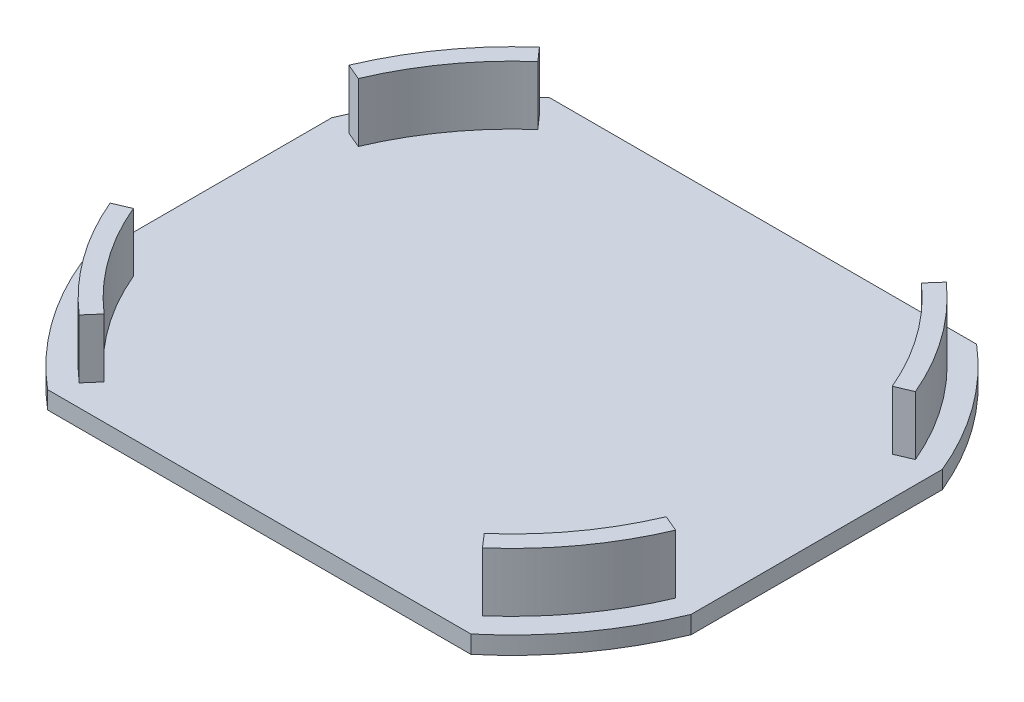
ISO-10303-21;
HEADER;
FILE_DESCRIPTION(('STEP AP214'),'2;1');
FILE_NAME('part.step','',(''),(''),'','','');
FILE_SCHEMA(('AUTOMOTIVE_DESIGN { 1 0 10303 214 1 1 1 1 }'));
ENDSEC;
DATA;
#1=APPLICATION_CONTEXT('core data for automotive mechanical design processes');
#2=APPLICATION_PROTOCOL_DEFINITION('international standard','automotive_design',2000,#1);
#3=PRODUCT_CONTEXT('',#1,'mechanical');
#4=PRODUCT('Part','Part','',(#3));
#5=PRODUCT_RELATED_PRODUCT_CATEGORY('part','',(#4));
#6=PRODUCT_DEFINITION_FORMATION('','',#4);
#7=PRODUCT_DEFINITION_CONTEXT('part definition',#1,'design');
#8=PRODUCT_DEFINITION('design','',#6,#7);
#9=PRODUCT_DEFINITION_SHAPE('','',#8);
#10=(LENGTH_UNIT() NAMED_UNIT(*) SI_UNIT(.MILLI.,.METRE.));
#11=(NAMED_UNIT(*) PLANE_ANGLE_UNIT() SI_UNIT($,.RADIAN.));
#12=(NAMED_UNIT(*) SI_UNIT($,.STERADIAN.) SOLID_ANGLE_UNIT());
#13=UNCERTAINTY_MEASURE_WITH_UNIT(LENGTH_MEASURE(1.E-05),#10,'distance_accuracy_value','');
#14=(GEOMETRIC_REPRESENTATION_CONTEXT(3) GLOBAL_UNCERTAINTY_ASSIGNED_CONTEXT((#13)) GLOBAL_UNIT_ASSIGNED_CONTEXT((#10,
#11,#12)) REPRESENTATION_CONTEXT('',''));
#15=CARTESIAN_POINT('',(0.,0.,0.));
#16=DIRECTION('',(0.,0.,1.));
#17=DIRECTION('',(1.,0.,0.));
#18=AXIS2_PLACEMENT_3D('',#15,#16,#17);
#19=CARTESIAN_POINT('',(0.,1.5,0.));
#20=DIRECTION('',(0.,1.,0.));
#21=DIRECTION('',(0.,0.,1.));
#22=AXIS2_PLACEMENT_3D('',#19,#20,#21);
#23=PLANE('',#22);
#24=CARTESIAN_POINT('',(0.,1.5,0.));
#25=DIRECTION('',(0.,1.,0.));
#26=DIRECTION('',(0.,0.,1.));
#27=AXIS2_PLACEMENT_3D('',#24,#25,#26);
#28=CIRCLE('',#27,28.);
#29=CARTESIAN_POINT('',(-18.1370651125038,1.5,-21.3318276081727));
#30=VERTEX_POINT('',#29);
#31=CARTESIAN_POINT('',(-25.9101771725426,1.5,-10.6142695880336));
#32=VERTEX_POINT('',#31);
#33=EDGE_CURVE('E310',#30,#32,#28,.T.);
#34=ORIENTED_EDGE('',*,*,#33,.T.);
#35=DIRECTION('',(0.,0.,1.));
#36=VECTOR('',#35,1.);
#37=CARTESIAN_POINT('',(-25.9101771725426,1.5,-10.6142695880336));
#38=LINE('',#37,#36);
#39=CARTESIAN_POINT('',(-25.9101771725426,1.5,10.6142695880336));
#40=VERTEX_POINT('',#39);
#41=EDGE_CURVE('E313',#32,#40,#38,.T.);
#42=ORIENTED_EDGE('',*,*,#41,.T.);
#43=CARTESIAN_POINT('',(0.,1.5,0.));
#44=DIRECTION('',(0.,1.,0.));
#45=DIRECTION('',(0.,0.,1.));
#46=AXIS2_PLACEMENT_3D('',#43,#44,#45);
#47=CIRCLE('',#46,28.);
#48=CARTESIAN_POINT('',(-17.9754714584844,1.5,21.4681723918273));
#49=VERTEX_POINT('',#48);
#50=EDGE_CURVE('E316',#40,#49,#47,.T.);
#51=ORIENTED_EDGE('',*,*,#50,.T.);
#52=DIRECTION('',(-1.,0.,0.));
#53=VECTOR('',#52,1.);
#54=CARTESIAN_POINT('',(17.9754714584844,1.5,21.4681723918273));
#55=LINE('',#54,#53);
#56=CARTESIAN_POINT('',(17.9754714584844,1.5,21.4681723918273));
#57=VERTEX_POINT('',#56);
#58=EDGE_CURVE('E318',#57,#49,#55,.T.);
#59=ORIENTED_EDGE('',*,*,#58,.F.);
#60=CARTESIAN_POINT('',(0.,1.5,0.));
#61=DIRECTION('',(0.,1.,0.));
#62=DIRECTION('',(0.,0.,1.));
#63=AXIS2_PLACEMENT_3D('',#60,#61,#62);
#64=CIRCLE('',#63,28.);
#65=CARTESIAN_POINT('',(25.8898228274574,1.5,10.6638207957029));
#66=VERTEX_POINT('',#65);
#67=EDGE_CURVE('E321',#57,#66,#64,.T.);
#68=ORIENTED_EDGE('',*,*,#67,.T.);
#69=DIRECTION('',(0.,0.,1.));
#70=VECTOR('',#69,1.);
#71=CARTESIAN_POINT('',(25.8898228274574,1.5,-10.6638207957029));
#72=LINE('',#71,#70);
#73=CARTESIAN_POINT('',(25.8898228274574,1.5,-10.6638207957029));
#74=VERTEX_POINT('',#73);
#75=EDGE_CURVE('E323',#74,#66,#72,.T.);
#76=ORIENTED_EDGE('',*,*,#75,.F.);
#77=CARTESIAN_POINT('',(0.,1.5,0.));
#78=DIRECTION('',(0.,1.,0.));
#79=DIRECTION('',(0.,0.,1.));
#80=AXIS2_PLACEMENT_3D('',#77,#78,#79);
#81=CIRCLE('',#80,28.);
#82=CARTESIAN_POINT('',(18.1370651125038,1.5,-21.3318276081727));
#83=VERTEX_POINT('',#82);
#84=EDGE_CURVE('E326',#74,#83,#81,.T.);
#85=ORIENTED_EDGE('',*,*,#84,.T.);
#86=DIRECTION('',(1.,0.,0.));
#87=VECTOR('',#86,1.);
#88=CARTESIAN_POINT('',(-18.1370651125038,1.5,-21.3318276081727));
#89=LINE('',#88,#87);
#90=EDGE_CURVE('E328',#30,#83,#89,.T.);
#91=ORIENTED_EDGE('',*,*,#90,.F.);
#92=EDGE_LOOP('',(#34,#42,#51,#59,#68,#76,#85,#91));
#93=FACE_BOUND('',#92,.T.);
#94=DIRECTION('',(0.921435232050472,0.,0.388531997570462));
#95=VECTOR('',#94,1.);
#96=CARTESIAN_POINT('',(-24.0494595565173,1.5,-10.1965281433696));
#97=LINE('',#96,#95);
#98=CARTESIAN_POINT('',(-24.0494595565173,1.5,-10.1965281433696));
#99=VERTEX_POINT('',#98);
#100=CARTESIAN_POINT('',(-22.6673067084416,1.5,-9.61373014701392));
#101=VERTEX_POINT('',#100);
#102=EDGE_CURVE('E294',#99,#101,#97,.T.);
#103=ORIENTED_EDGE('',*,*,#102,.F.);
#104=CARTESIAN_POINT('',(0.,1.5,-0.0558430067805846));
#105=DIRECTION('',(0.,1.,0.));
#106=DIRECTION('',(0.,0.,1.));
#107=AXIS2_PLACEMENT_3D('',#104,#105,#106);
#108=CIRCLE('',#107,26.1);
#109=CARTESIAN_POINT('',(-17.283724514649,1.5,-19.6130122012658));
#110=VERTEX_POINT('',#109);
#111=EDGE_CURVE('E280',#110,#99,#108,.T.);
#112=ORIENTED_EDGE('',*,*,#111,.F.);
#113=DIRECTION('',(-0.662211667227935,0.,-0.749316827374909));
#114=VECTOR('',#113,1.);
#115=CARTESIAN_POINT('',(-17.283724514649,1.5,-19.6130122012658));
#116=LINE('',#115,#114);
#117=CARTESIAN_POINT('',(-16.2904070138071,1.5,-18.4890369602034));
#118=VERTEX_POINT('',#117);
#119=EDGE_CURVE('E285',#118,#110,#116,.T.);
#120=ORIENTED_EDGE('',*,*,#119,.F.);
#121=CARTESIAN_POINT('',(0.,1.5,-0.0558430067805833));
#122=DIRECTION('',(0.,-1.,0.));
#123=DIRECTION('',(0.,0.,1.));
#124=AXIS2_PLACEMENT_3D('',#121,#122,#123);
#125=CIRCLE('',#124,24.6);
#126=EDGE_CURVE('E296',#101,#118,#125,.T.);
#127=ORIENTED_EDGE('',*,*,#126,.F.);
#128=EDGE_LOOP('',(#103,#112,#120,#127));
#129=FACE_BOUND('',#128,.T.);
#130=DIRECTION('',(-0.662211667227933,0.,0.749316827374911));
#131=VECTOR('',#130,1.);
#132=CARTESIAN_POINT('',(17.283724514649,1.5,-19.6130122012658));
#133=LINE('',#132,#131);
#134=CARTESIAN_POINT('',(17.283724514649,1.5,-19.6130122012658));
#135=VERTEX_POINT('',#134);
#136=CARTESIAN_POINT('',(16.2904070138071,1.5,-18.4890369602034));
#137=VERTEX_POINT('',#136);
#138=EDGE_CURVE('E265',#135,#137,#133,.T.);
#139=ORIENTED_EDGE('',*,*,#138,.F.);
#140=CARTESIAN_POINT('',(0.,1.5,-0.0558430067805846));
#141=DIRECTION('',(0.,1.,0.));
#142=DIRECTION('',(0.,0.,1.));
#143=AXIS2_PLACEMENT_3D('',#140,#141,#142);
#144=CIRCLE('',#143,26.1);
#145=CARTESIAN_POINT('',(24.0294878119037,1.5,-10.2437630838901));
#146=VERTEX_POINT('',#145);
#147=EDGE_CURVE('E251',#146,#135,#144,.T.);
#148=ORIENTED_EDGE('',*,*,#147,.F.);
#149=DIRECTION('',(0.920670031107421,0.,-0.390341765406496));
#150=VECTOR('',#149,1.);
#151=CARTESIAN_POINT('',(22.6484827652426,1.5,-9.65825043578035));
#152=LINE('',#151,#150);
#153=CARTESIAN_POINT('',(22.6484827652426,1.5,-9.65825043578035));
#154=VERTEX_POINT('',#153);
#155=EDGE_CURVE('E256',#154,#146,#152,.T.);
#156=ORIENTED_EDGE('',*,*,#155,.F.);
#157=CARTESIAN_POINT('',(0.,1.5,-0.0558430067805833));
#158=DIRECTION('',(0.,-1.,0.));
#159=DIRECTION('',(0.,0.,1.));
#160=AXIS2_PLACEMENT_3D('',#157,#158,#159);
#161=CIRCLE('',#160,24.6);
#162=EDGE_CURVE('E267',#137,#154,#161,.T.);
#163=ORIENTED_EDGE('',*,*,#162,.F.);
#164=EDGE_LOOP('',(#139,#148,#156,#163));
#165=FACE_BOUND('',#164,.T.);
#166=DIRECTION('',(0.656366061645361,0.,-0.754442571121327));
#167=VECTOR('',#166,1.);
#168=CARTESIAN_POINT('',(-16.1466051164759,1.5,18.503444242804));
#169=LINE('',#168,#167);
#170=CARTESIAN_POINT('',(-17.131154208944,1.5,19.635108099486));
#171=VERTEX_POINT('',#170);
#172=CARTESIAN_POINT('',(-16.1466051164759,1.5,18.503444242804));
#173=VERTEX_POINT('',#172);
#174=EDGE_CURVE('E223',#171,#173,#169,.T.);
#175=ORIENTED_EDGE('',*,*,#174,.F.);
#176=CARTESIAN_POINT('',(0.,1.5,-0.0558430067805846));
#177=DIRECTION('',(0.,1.,0.));
#178=DIRECTION('',(0.,0.,1.));
#179=AXIS2_PLACEMENT_3D('',#176,#177,#178);
#180=CIRCLE('',#179,26.1);
#181=CARTESIAN_POINT('',(-24.0494595565174,1.5,10.0848421298084));
#182=VERTEX_POINT('',#181);
#183=EDGE_CURVE('E220',#182,#171,#180,.T.);
#184=ORIENTED_EDGE('',*,*,#183,.F.);
#185=DIRECTION('',(-0.92143523205047,0.,0.388531997570465));
#186=VECTOR('',#185,1.);
#187=CARTESIAN_POINT('',(-24.0494595565174,1.5,10.0848421298084));
#188=LINE('',#187,#186);
#189=CARTESIAN_POINT('',(-22.6673067084416,1.5,9.50204413345273));
#190=VERTEX_POINT('',#189);
#191=EDGE_CURVE('E232',#190,#182,#188,.T.);
#192=ORIENTED_EDGE('',*,*,#191,.F.);
#193=CARTESIAN_POINT('',(0.,1.5,-0.0558430067805833));
#194=DIRECTION('',(0.,-1.,0.));
#195=DIRECTION('',(0.,0.,1.));
#196=AXIS2_PLACEMENT_3D('',#193,#194,#195);
#197=CIRCLE('',#196,24.6);
#198=EDGE_CURVE('E240',#173,#190,#197,.T.);
#199=ORIENTED_EDGE('',*,*,#198,.F.);
#200=EDGE_LOOP('',(#175,#184,#192,#199));
#201=FACE_BOUND('',#200,.T.);
#202=DIRECTION('',(-0.920670031107423,0.,-0.390341765406493));
#203=VECTOR('',#202,1.);
#204=CARTESIAN_POINT('',(22.6484827652426,1.5,9.54656442221918));
#205=LINE('',#204,#203);
#206=CARTESIAN_POINT('',(24.0294878119037,1.5,10.1320770703289));
#207=VERTEX_POINT('',#206);
#208=CARTESIAN_POINT('',(22.6484827652426,1.5,9.54656442221918));
#209=VERTEX_POINT('',#208);
#210=EDGE_CURVE('E679',#207,#209,#205,.T.);
#211=ORIENTED_EDGE('',*,*,#210,.F.);
#212=CARTESIAN_POINT('',(0.,1.5,-0.0558430067805846));
#213=DIRECTION('',(0.,1.,0.));
#214=DIRECTION('',(0.,0.,1.));
#215=AXIS2_PLACEMENT_3D('',#212,#213,#214);
#216=CIRCLE('',#215,26.1);
#217=CARTESIAN_POINT('',(17.131154208944,1.5,19.635108099486));
#218=VERTEX_POINT('',#217);
#219=EDGE_CURVE('E218',#218,#207,#216,.T.);
#220=ORIENTED_EDGE('',*,*,#219,.F.);
#221=DIRECTION('',(0.656366061645363,0.,0.754442571121325));
#222=VECTOR('',#221,1.);
#223=CARTESIAN_POINT('',(16.1466051164759,1.5,18.503444242804));
#224=LINE('',#223,#222);
#225=CARTESIAN_POINT('',(16.1466051164759,1.5,18.503444242804));
#226=VERTEX_POINT('',#225);
#227=EDGE_CURVE('E214',#226,#218,#224,.T.);
#228=ORIENTED_EDGE('',*,*,#227,.F.);
#229=CARTESIAN_POINT('',(0.,1.5,-0.0558430067805833));
#230=DIRECTION('',(0.,-1.,0.));
#231=DIRECTION('',(0.,0.,1.));
#232=AXIS2_PLACEMENT_3D('',#229,#230,#231);
#233=CIRCLE('',#232,24.6);
#234=EDGE_CURVE('E676',#209,#226,#233,.T.);
#235=ORIENTED_EDGE('',*,*,#234,.F.);
#236=EDGE_LOOP('',(#211,#220,#228,#235));
#237=FACE_BOUND('',#236,.T.);
#238=ADVANCED_FACE('F33',(#93,#129,#165,#201,#237),#23,.T.);
#239=CARTESIAN_POINT('',(0.,1.5,0.));
#240=DIRECTION('',(0.,-1.,0.));
#241=DIRECTION('',(0.,0.,-1.));
#242=AXIS2_PLACEMENT_3D('',#239,#240,#241);
#243=CYLINDRICAL_SURFACE('',#242,28.);
#244=CARTESIAN_POINT('',(0.,0.,0.));
#245=DIRECTION('',(0.,1.,0.));
#246=DIRECTION('',(0.,0.,1.));
#247=AXIS2_PLACEMENT_3D('',#244,#245,#246);
#248=CIRCLE('',#247,28.);
#249=CARTESIAN_POINT('',(-18.1370651125038,0.,-21.3318276081727));
#250=VERTEX_POINT('',#249);
#251=CARTESIAN_POINT('',(-25.9101771725426,0.,-10.6142695880336));
#252=VERTEX_POINT('',#251);
#253=EDGE_CURVE('E309',#250,#252,#248,.T.);
#254=ORIENTED_EDGE('',*,*,#253,.T.);
#255=DIRECTION('',(0.,-1.,0.));
#256=VECTOR('',#255,1.);
#257=CARTESIAN_POINT('',(-25.9101771725426,1.5,-10.6142695880336));
#258=LINE('',#257,#256);
#259=EDGE_CURVE('E11',#32,#252,#258,.T.);
#260=ORIENTED_EDGE('',*,*,#259,.F.);
#261=ORIENTED_EDGE('',*,*,#33,.F.);
#262=DIRECTION('',(0.,-1.,0.));
#263=VECTOR('',#262,1.);
#264=CARTESIAN_POINT('',(-18.1370651125038,1.5,-21.3318276081727));
#265=LINE('',#264,#263);
#266=EDGE_CURVE('E331',#30,#250,#265,.T.);
#267=ORIENTED_EDGE('',*,*,#266,.T.);
#268=EDGE_LOOP('',(#254,#260,#261,#267));
#269=FACE_BOUND('',#268,.T.);
#270=ADVANCED_FACE('F35',(#269),#243,.T.);
#271=CARTESIAN_POINT('',(-25.9101771725426,1.5,-10.6142695880336));
#272=DIRECTION('',(1.,0.,0.));
#273=DIRECTION('',(0.,0.,-1.));
#274=AXIS2_PLACEMENT_3D('',#271,#272,#273);
#275=PLANE('',#274);
#276=DIRECTION('',(0.,0.,1.));
#277=VECTOR('',#276,1.);
#278=CARTESIAN_POINT('',(-25.9101771725426,0.,-10.6142695880336));
#279=LINE('',#278,#277);
#280=CARTESIAN_POINT('',(-25.9101771725426,0.,10.6142695880336));
#281=VERTEX_POINT('',#280);
#282=EDGE_CURVE('E334',#252,#281,#279,.T.);
#283=ORIENTED_EDGE('',*,*,#282,.T.);
#284=DIRECTION('',(0.,-1.,0.));
#285=VECTOR('',#284,1.);
#286=CARTESIAN_POINT('',(-25.9101771725426,1.5,10.6142695880336));
#287=LINE('',#286,#285);
#288=EDGE_CURVE('E41',#40,#281,#287,.T.);
#289=ORIENTED_EDGE('',*,*,#288,.F.);
#290=ORIENTED_EDGE('',*,*,#41,.F.);
#291=ORIENTED_EDGE('',*,*,#259,.T.);
#292=EDGE_LOOP('',(#283,#289,#290,#291));
#293=FACE_BOUND('',#292,.T.);
#294=ADVANCED_FACE('F387',(#293),#275,.F.);
#295=CARTESIAN_POINT('',(0.,1.5,0.));
#296=DIRECTION('',(0.,-1.,0.));
#297=DIRECTION('',(0.,0.,-1.));
#298=AXIS2_PLACEMENT_3D('',#295,#296,#297);
#299=CYLINDRICAL_SURFACE('',#298,28.);
#300=CARTESIAN_POINT('',(0.,0.,0.));
#301=DIRECTION('',(0.,1.,0.));
#302=DIRECTION('',(0.,0.,1.));
#303=AXIS2_PLACEMENT_3D('',#300,#301,#302);
#304=CIRCLE('',#303,28.);
#305=CARTESIAN_POINT('',(-17.9754714584844,0.,21.4681723918273));
#306=VERTEX_POINT('',#305);
#307=EDGE_CURVE('E336',#281,#306,#304,.T.);
#308=ORIENTED_EDGE('',*,*,#307,.T.);
#309=DIRECTION('',(0.,-1.,0.));
#310=VECTOR('',#309,1.);
#311=CARTESIAN_POINT('',(-17.9754714584844,1.5,21.4681723918273));
#312=LINE('',#311,#310);
#313=EDGE_CURVE('E362',#49,#306,#312,.T.);
#314=ORIENTED_EDGE('',*,*,#313,.F.);
#315=ORIENTED_EDGE('',*,*,#50,.F.);
#316=ORIENTED_EDGE('',*,*,#288,.T.);
#317=EDGE_LOOP('',(#308,#314,#315,#316));
#318=FACE_BOUND('',#317,.T.);
#319=ADVANCED_FACE('F368',(#318),#299,.T.);
#320=CARTESIAN_POINT('',(17.9754714584844,1.5,21.4681723918273));
#321=DIRECTION('',(0.,0.,1.));
#322=DIRECTION('',(1.,0.,0.));
#323=AXIS2_PLACEMENT_3D('',#320,#321,#322);
#324=PLANE('',#323);
#325=DIRECTION('',(-1.,0.,0.));
#326=VECTOR('',#325,1.);
#327=CARTESIAN_POINT('',(17.9754714584844,0.,21.4681723918273));
#328=LINE('',#327,#326);
#329=CARTESIAN_POINT('',(17.9754714584844,0.,21.4681723918273));
#330=VERTEX_POINT('',#329);
#331=EDGE_CURVE('E339',#330,#306,#328,.T.);
#332=ORIENTED_EDGE('',*,*,#331,.F.);
#333=DIRECTION('',(0.,-1.,0.));
#334=VECTOR('',#333,1.);
#335=CARTESIAN_POINT('',(17.9754714584844,1.5,21.4681723918273));
#336=LINE('',#335,#334);
#337=EDGE_CURVE('E360',#57,#330,#336,.T.);
#338=ORIENTED_EDGE('',*,*,#337,.F.);
#339=ORIENTED_EDGE('',*,*,#58,.T.);
#340=ORIENTED_EDGE('',*,*,#313,.T.);
#341=EDGE_LOOP('',(#332,#338,#339,#340));
#342=FACE_BOUND('',#341,.T.);
#343=ADVANCED_FACE('F377',(#342),#324,.T.);
#344=CARTESIAN_POINT('',(0.,1.5,0.));
#345=DIRECTION('',(0.,-1.,0.));
#346=DIRECTION('',(0.,0.,-1.));
#347=AXIS2_PLACEMENT_3D('',#344,#345,#346);
#348=CYLINDRICAL_SURFACE('',#347,28.);
#349=CARTESIAN_POINT('',(0.,0.,0.));
#350=DIRECTION('',(0.,1.,0.));
#351=DIRECTION('',(0.,0.,1.));
#352=AXIS2_PLACEMENT_3D('',#349,#350,#351);
#353=CIRCLE('',#352,28.);
#354=CARTESIAN_POINT('',(25.8898228274574,0.,10.6638207957029));
#355=VERTEX_POINT('',#354);
#356=EDGE_CURVE('E342',#330,#355,#353,.T.);
#357=ORIENTED_EDGE('',*,*,#356,.T.);
#358=DIRECTION('',(0.,-1.,0.));
#359=VECTOR('',#358,1.);
#360=CARTESIAN_POINT('',(25.8898228274574,1.5,10.6638207957029));
#361=LINE('',#360,#359);
#362=EDGE_CURVE('E358',#66,#355,#361,.T.);
#363=ORIENTED_EDGE('',*,*,#362,.F.);
#364=ORIENTED_EDGE('',*,*,#67,.F.);
#365=ORIENTED_EDGE('',*,*,#337,.T.);
#366=EDGE_LOOP('',(#357,#363,#364,#365));
#367=FACE_BOUND('',#366,.T.);
#368=ADVANCED_FACE('F401',(#367),#348,.T.);
#369=CARTESIAN_POINT('',(25.8898228274574,1.5,-10.6638207957029));
#370=DIRECTION('',(1.,0.,0.));
#371=DIRECTION('',(0.,0.,-1.));
#372=AXIS2_PLACEMENT_3D('',#369,#370,#371);
#373=PLANE('',#372);
#374=DIRECTION('',(0.,0.,1.));
#375=VECTOR('',#374,1.);
#376=CARTESIAN_POINT('',(25.8898228274574,0.,-10.6638207957029));
#377=LINE('',#376,#375);
#378=CARTESIAN_POINT('',(25.8898228274574,0.,-10.6638207957029));
#379=VERTEX_POINT('',#378);
#380=EDGE_CURVE('E345',#379,#355,#377,.T.);
#381=ORIENTED_EDGE('',*,*,#380,.F.);
#382=DIRECTION('',(0.,-1.,0.));
#383=VECTOR('',#382,1.);
#384=CARTESIAN_POINT('',(25.8898228274574,1.5,-10.6638207957029));
#385=LINE('',#384,#383);
#386=EDGE_CURVE('E356',#74,#379,#385,.T.);
#387=ORIENTED_EDGE('',*,*,#386,.F.);
#388=ORIENTED_EDGE('',*,*,#75,.T.);
#389=ORIENTED_EDGE('',*,*,#362,.T.);
#390=EDGE_LOOP('',(#381,#387,#388,#389));
#391=FACE_BOUND('',#390,.T.);
#392=ADVANCED_FACE('F399',(#391),#373,.T.);
#393=CARTESIAN_POINT('',(0.,1.5,0.));
#394=DIRECTION('',(0.,-1.,0.));
#395=DIRECTION('',(0.,0.,-1.));
#396=AXIS2_PLACEMENT_3D('',#393,#394,#395);
#397=CYLINDRICAL_SURFACE('',#396,28.);
#398=CARTESIAN_POINT('',(0.,0.,0.));
#399=DIRECTION('',(0.,1.,0.));
#400=DIRECTION('',(0.,0.,1.));
#401=AXIS2_PLACEMENT_3D('',#398,#399,#400);
#402=CIRCLE('',#401,28.);
#403=CARTESIAN_POINT('',(18.1370651125038,0.,-21.3318276081727));
#404=VERTEX_POINT('',#403);
#405=EDGE_CURVE('E348',#379,#404,#402,.T.);
#406=ORIENTED_EDGE('',*,*,#405,.T.);
#407=DIRECTION('',(0.,-1.,0.));
#408=VECTOR('',#407,1.);
#409=CARTESIAN_POINT('',(18.1370651125038,1.5,-21.3318276081727));
#410=LINE('',#409,#408);
#411=EDGE_CURVE('E354',#83,#404,#410,.T.);
#412=ORIENTED_EDGE('',*,*,#411,.F.);
#413=ORIENTED_EDGE('',*,*,#84,.F.);
#414=ORIENTED_EDGE('',*,*,#386,.T.);
#415=EDGE_LOOP('',(#406,#412,#413,#414));
#416=FACE_BOUND('',#415,.T.);
#417=ADVANCED_FACE('F396',(#416),#397,.T.);
#418=CARTESIAN_POINT('',(-18.1370651125038,1.5,-21.3318276081727));
#419=DIRECTION('',(0.,0.,-1.));
#420=DIRECTION('',(-1.,0.,0.));
#421=AXIS2_PLACEMENT_3D('',#418,#419,#420);
#422=PLANE('',#421);
#423=DIRECTION('',(1.,0.,0.));
#424=VECTOR('',#423,1.);
#425=CARTESIAN_POINT('',(-18.1370651125038,0.,-21.3318276081727));
#426=LINE('',#425,#424);
#427=EDGE_CURVE('E314',#250,#404,#426,.T.);
#428=ORIENTED_EDGE('',*,*,#427,.F.);
#429=ORIENTED_EDGE('',*,*,#266,.F.);
#430=ORIENTED_EDGE('',*,*,#90,.T.);
#431=ORIENTED_EDGE('',*,*,#411,.T.);
#432=EDGE_LOOP('',(#428,#429,#430,#431));
#433=FACE_BOUND('',#432,.T.);
#434=ADVANCED_FACE('F392',(#433),#422,.T.);
#435=CARTESIAN_POINT('',(0.,0.,0.));
#436=DIRECTION('',(0.,1.,0.));
#437=DIRECTION('',(0.,0.,1.));
#438=AXIS2_PLACEMENT_3D('',#435,#436,#437);
#439=PLANE('',#438);
#440=ORIENTED_EDGE('',*,*,#253,.F.);
#441=ORIENTED_EDGE('',*,*,#427,.T.);
#442=ORIENTED_EDGE('',*,*,#405,.F.);
#443=ORIENTED_EDGE('',*,*,#380,.T.);
#444=ORIENTED_EDGE('',*,*,#356,.F.);
#445=ORIENTED_EDGE('',*,*,#331,.T.);
#446=ORIENTED_EDGE('',*,*,#307,.F.);
#447=ORIENTED_EDGE('',*,*,#282,.F.);
#448=EDGE_LOOP('',(#440,#441,#442,#443,#444,#445,#446,#447));
#449=FACE_BOUND('',#448,.T.);
#450=ADVANCED_FACE('F373',(#449),#439,.F.);
#451=CARTESIAN_POINT('',(0.,6.5,-0.0558430067805846));
#452=DIRECTION('',(0.,-1.,0.));
#453=DIRECTION('',(0.,0.,-1.));
#454=AXIS2_PLACEMENT_3D('',#451,#452,#453);
#455=CYLINDRICAL_SURFACE('',#454,26.1);
#456=ORIENTED_EDGE('',*,*,#111,.T.);
#457=DIRECTION('',(0.,-1.,0.));
#458=VECTOR('',#457,1.);
#459=CARTESIAN_POINT('',(-24.0494595565173,6.5,-10.1965281433696));
#460=LINE('',#459,#458);
#461=CARTESIAN_POINT('',(-24.0494595565173,6.5,-10.1965281433696));
#462=VERTEX_POINT('',#461);
#463=EDGE_CURVE('E307',#462,#99,#460,.T.);
#464=ORIENTED_EDGE('',*,*,#463,.F.);
#465=CARTESIAN_POINT('',(0.,6.5,-0.0558430067805846));
#466=DIRECTION('',(0.,1.,0.));
#467=DIRECTION('',(0.,0.,1.));
#468=AXIS2_PLACEMENT_3D('',#465,#466,#467);
#469=CIRCLE('',#468,26.1);
#470=CARTESIAN_POINT('',(-17.283724514649,6.5,-19.6130122012658));
#471=VERTEX_POINT('',#470);
#472=EDGE_CURVE('E281',#471,#462,#469,.T.);
#473=ORIENTED_EDGE('',*,*,#472,.F.);
#474=DIRECTION('',(0.,-1.,0.));
#475=VECTOR('',#474,1.);
#476=CARTESIAN_POINT('',(-17.283724514649,6.5,-19.6130122012658));
#477=LINE('',#476,#475);
#478=EDGE_CURVE('E291',#471,#110,#477,.T.);
#479=ORIENTED_EDGE('',*,*,#478,.T.);
#480=EDGE_LOOP('',(#456,#464,#473,#479));
#481=FACE_BOUND('',#480,.T.);
#482=ADVANCED_FACE('F417',(#481),#455,.T.);
#483=CARTESIAN_POINT('',(-24.0494595565173,6.5,-10.1965281433696));
#484=DIRECTION('',(0.388531997570462,0.,-0.921435232050472));
#485=DIRECTION('',(-0.921435232050472,0.,-0.388531997570462));
#486=AXIS2_PLACEMENT_3D('',#483,#484,#485);
#487=PLANE('',#486);
#488=ORIENTED_EDGE('',*,*,#102,.T.);
#489=DIRECTION('',(0.,-1.,0.));
#490=VECTOR('',#489,1.);
#491=CARTESIAN_POINT('',(-22.6673067084416,6.5,-9.61373014701392));
#492=LINE('',#491,#490);
#493=CARTESIAN_POINT('',(-22.6673067084416,6.5,-9.61373014701392));
#494=VERTEX_POINT('',#493);
#495=EDGE_CURVE('E304',#494,#101,#492,.T.);
#496=ORIENTED_EDGE('',*,*,#495,.F.);
#497=DIRECTION('',(0.921435232050472,0.,0.388531997570462));
#498=VECTOR('',#497,1.);
#499=CARTESIAN_POINT('',(-24.0494595565173,6.5,-10.1965281433696));
#500=LINE('',#499,#498);
#501=EDGE_CURVE('E284',#462,#494,#500,.T.);
#502=ORIENTED_EDGE('',*,*,#501,.F.);
#503=ORIENTED_EDGE('',*,*,#463,.T.);
#504=EDGE_LOOP('',(#488,#496,#502,#503));
#505=FACE_BOUND('',#504,.T.);
#506=ADVANCED_FACE('F442',(#505),#487,.F.);
#507=CARTESIAN_POINT('',(0.,6.5,-0.0558430067805833));
#508=DIRECTION('',(0.,-1.,0.));
#509=DIRECTION('',(0.,0.,-1.));
#510=AXIS2_PLACEMENT_3D('',#507,#508,#509);
#511=CYLINDRICAL_SURFACE('',#510,24.6);
#512=ORIENTED_EDGE('',*,*,#126,.T.);
#513=DIRECTION('',(0.,-1.,0.));
#514=VECTOR('',#513,1.);
#515=CARTESIAN_POINT('',(-16.2904070138071,6.5,-18.4890369602034));
#516=LINE('',#515,#514);
#517=CARTESIAN_POINT('',(-16.2904070138071,6.5,-18.4890369602034));
#518=VERTEX_POINT('',#517);
#519=EDGE_CURVE('E302',#518,#118,#516,.T.);
#520=ORIENTED_EDGE('',*,*,#519,.F.);
#521=CARTESIAN_POINT('',(0.,6.5,-0.0558430067805833));
#522=DIRECTION('',(0.,-1.,0.));
#523=DIRECTION('',(0.,0.,1.));
#524=AXIS2_PLACEMENT_3D('',#521,#522,#523);
#525=CIRCLE('',#524,24.6);
#526=EDGE_CURVE('E287',#494,#518,#525,.T.);
#527=ORIENTED_EDGE('',*,*,#526,.F.);
#528=ORIENTED_EDGE('',*,*,#495,.T.);
#529=EDGE_LOOP('',(#512,#520,#527,#528));
#530=FACE_BOUND('',#529,.T.);
#531=ADVANCED_FACE('F449',(#530),#511,.F.);
#532=CARTESIAN_POINT('',(-17.283724514649,6.5,-19.6130122012658));
#533=DIRECTION('',(-0.749316827374909,0.,0.662211667227935));
#534=DIRECTION('',(0.662211667227935,0.,0.749316827374909));
#535=AXIS2_PLACEMENT_3D('',#532,#533,#534);
#536=PLANE('',#535);
#537=ORIENTED_EDGE('',*,*,#119,.T.);
#538=ORIENTED_EDGE('',*,*,#478,.F.);
#539=DIRECTION('',(-0.662211667227935,0.,-0.749316827374909));
#540=VECTOR('',#539,1.);
#541=CARTESIAN_POINT('',(-17.283724514649,6.5,-19.6130122012658));
#542=LINE('',#541,#540);
#543=EDGE_CURVE('E289',#518,#471,#542,.T.);
#544=ORIENTED_EDGE('',*,*,#543,.F.);
#545=ORIENTED_EDGE('',*,*,#519,.T.);
#546=EDGE_LOOP('',(#537,#538,#544,#545));
#547=FACE_BOUND('',#546,.T.);
#548=ADVANCED_FACE('F456',(#547),#536,.F.);
#549=CARTESIAN_POINT('',(0.,6.5,-0.0558430067805846));
#550=DIRECTION('',(0.,1.,0.));
#551=DIRECTION('',(0.,0.,1.));
#552=AXIS2_PLACEMENT_3D('',#549,#550,#551);
#553=PLANE('',#552);
#554=ORIENTED_EDGE('',*,*,#472,.T.);
#555=ORIENTED_EDGE('',*,*,#501,.T.);
#556=ORIENTED_EDGE('',*,*,#526,.T.);
#557=ORIENTED_EDGE('',*,*,#543,.T.);
#558=EDGE_LOOP('',(#554,#555,#556,#557));
#559=FACE_BOUND('',#558,.T.);
#560=ADVANCED_FACE('F464',(#559),#553,.T.);
#561=CARTESIAN_POINT('',(0.,6.5,-0.0558430067805846));
#562=DIRECTION('',(0.,-1.,0.));
#563=DIRECTION('',(0.,0.,-1.));
#564=AXIS2_PLACEMENT_3D('',#561,#562,#563);
#565=CYLINDRICAL_SURFACE('',#564,26.1);
#566=ORIENTED_EDGE('',*,*,#147,.T.);
#567=DIRECTION('',(0.,-1.,0.));
#568=VECTOR('',#567,1.);
#569=CARTESIAN_POINT('',(17.283724514649,6.5,-19.6130122012658));
#570=LINE('',#569,#568);
#571=CARTESIAN_POINT('',(17.283724514649,6.5,-19.6130122012658));
#572=VERTEX_POINT('',#571);
#573=EDGE_CURVE('E278',#572,#135,#570,.T.);
#574=ORIENTED_EDGE('',*,*,#573,.F.);
#575=CARTESIAN_POINT('',(0.,6.5,-0.0558430067805846));
#576=DIRECTION('',(0.,1.,0.));
#577=DIRECTION('',(0.,0.,1.));
#578=AXIS2_PLACEMENT_3D('',#575,#576,#577);
#579=CIRCLE('',#578,26.1);
#580=CARTESIAN_POINT('',(24.0294878119037,6.5,-10.2437630838901));
#581=VERTEX_POINT('',#580);
#582=EDGE_CURVE('E252',#581,#572,#579,.T.);
#583=ORIENTED_EDGE('',*,*,#582,.F.);
#584=DIRECTION('',(0.,-1.,0.));
#585=VECTOR('',#584,1.);
#586=CARTESIAN_POINT('',(24.0294878119037,6.5,-10.2437630838901));
#587=LINE('',#586,#585);
#588=EDGE_CURVE('E262',#581,#146,#587,.T.);
#589=ORIENTED_EDGE('',*,*,#588,.T.);
#590=EDGE_LOOP('',(#566,#574,#583,#589));
#591=FACE_BOUND('',#590,.T.);
#592=ADVANCED_FACE('F472',(#591),#565,.T.);
#593=CARTESIAN_POINT('',(17.283724514649,6.5,-19.6130122012658));
#594=DIRECTION('',(0.749316827374911,0.,0.662211667227933));
#595=DIRECTION('',(0.662211667227933,0.,-0.749316827374911));
#596=AXIS2_PLACEMENT_3D('',#593,#594,#595);
#597=PLANE('',#596);
#598=ORIENTED_EDGE('',*,*,#138,.T.);
#599=DIRECTION('',(0.,-1.,0.));
#600=VECTOR('',#599,1.);
#601=CARTESIAN_POINT('',(16.2904070138071,6.5,-18.4890369602034));
#602=LINE('',#601,#600);
#603=CARTESIAN_POINT('',(16.2904070138071,6.5,-18.4890369602034));
#604=VERTEX_POINT('',#603);
#605=EDGE_CURVE('E275',#604,#137,#602,.T.);
#606=ORIENTED_EDGE('',*,*,#605,.F.);
#607=DIRECTION('',(-0.662211667227933,0.,0.749316827374911));
#608=VECTOR('',#607,1.);
#609=CARTESIAN_POINT('',(17.283724514649,6.5,-19.6130122012658));
#610=LINE('',#609,#608);
#611=EDGE_CURVE('E255',#572,#604,#610,.T.);
#612=ORIENTED_EDGE('',*,*,#611,.F.);
#613=ORIENTED_EDGE('',*,*,#573,.T.);
#614=EDGE_LOOP('',(#598,#606,#612,#613));
#615=FACE_BOUND('',#614,.T.);
#616=ADVANCED_FACE('F480',(#615),#597,.F.);
#617=CARTESIAN_POINT('',(0.,6.5,-0.0558430067805833));
#618=DIRECTION('',(0.,-1.,0.));
#619=DIRECTION('',(0.,0.,-1.));
#620=AXIS2_PLACEMENT_3D('',#617,#618,#619);
#621=CYLINDRICAL_SURFACE('',#620,24.6);
#622=ORIENTED_EDGE('',*,*,#162,.T.);
#623=DIRECTION('',(0.,-1.,0.));
#624=VECTOR('',#623,1.);
#625=CARTESIAN_POINT('',(22.6484827652426,6.5,-9.65825043578035));
#626=LINE('',#625,#624);
#627=CARTESIAN_POINT('',(22.6484827652426,6.5,-9.65825043578035));
#628=VERTEX_POINT('',#627);
#629=EDGE_CURVE('E273',#628,#154,#626,.T.);
#630=ORIENTED_EDGE('',*,*,#629,.F.);
#631=CARTESIAN_POINT('',(0.,6.5,-0.0558430067805833));
#632=DIRECTION('',(0.,-1.,0.));
#633=DIRECTION('',(0.,0.,1.));
#634=AXIS2_PLACEMENT_3D('',#631,#632,#633);
#635=CIRCLE('',#634,24.6);
#636=EDGE_CURVE('E258',#604,#628,#635,.T.);
#637=ORIENTED_EDGE('',*,*,#636,.F.);
#638=ORIENTED_EDGE('',*,*,#605,.T.);
#639=EDGE_LOOP('',(#622,#630,#637,#638));
#640=FACE_BOUND('',#639,.T.);
#641=ADVANCED_FACE('F488',(#640),#621,.F.);
#642=CARTESIAN_POINT('',(22.6484827652426,6.5,-9.65825043578035));
#643=DIRECTION('',(-0.390341765406496,0.,-0.920670031107421));
#644=DIRECTION('',(-0.920670031107422,0.,0.390341765406496));
#645=AXIS2_PLACEMENT_3D('',#642,#643,#644);
#646=PLANE('',#645);
#647=ORIENTED_EDGE('',*,*,#155,.T.);
#648=ORIENTED_EDGE('',*,*,#588,.F.);
#649=DIRECTION('',(0.920670031107421,0.,-0.390341765406496));
#650=VECTOR('',#649,1.);
#651=CARTESIAN_POINT('',(22.6484827652426,6.5,-9.65825043578035));
#652=LINE('',#651,#650);
#653=EDGE_CURVE('E260',#628,#581,#652,.T.);
#654=ORIENTED_EDGE('',*,*,#653,.F.);
#655=ORIENTED_EDGE('',*,*,#629,.T.);
#656=EDGE_LOOP('',(#647,#648,#654,#655));
#657=FACE_BOUND('',#656,.T.);
#658=ADVANCED_FACE('F496',(#657),#646,.F.);
#659=CARTESIAN_POINT('',(0.,6.5,-0.0558430067805846));
#660=DIRECTION('',(0.,1.,0.));
#661=DIRECTION('',(0.,0.,1.));
#662=AXIS2_PLACEMENT_3D('',#659,#660,#661);
#663=PLANE('',#662);
#664=ORIENTED_EDGE('',*,*,#582,.T.);
#665=ORIENTED_EDGE('',*,*,#611,.T.);
#666=ORIENTED_EDGE('',*,*,#636,.T.);
#667=ORIENTED_EDGE('',*,*,#653,.T.);
#668=EDGE_LOOP('',(#664,#665,#666,#667));
#669=FACE_BOUND('',#668,.T.);
#670=ADVANCED_FACE('F504',(#669),#663,.T.);
#671=CARTESIAN_POINT('',(0.,6.5,-0.0558430067805846));
#672=DIRECTION('',(0.,-1.,0.));
#673=DIRECTION('',(0.,0.,-1.));
#674=AXIS2_PLACEMENT_3D('',#671,#672,#673);
#675=CYLINDRICAL_SURFACE('',#674,26.1);
#676=ORIENTED_EDGE('',*,*,#183,.T.);
#677=DIRECTION('',(0.,-1.,0.));
#678=VECTOR('',#677,1.);
#679=CARTESIAN_POINT('',(-17.131154208944,6.5,19.635108099486));
#680=LINE('',#679,#678);
#681=CARTESIAN_POINT('',(-17.131154208944,6.5,19.635108099486));
#682=VERTEX_POINT('',#681);
#683=EDGE_CURVE('E249',#682,#171,#680,.T.);
#684=ORIENTED_EDGE('',*,*,#683,.F.);
#685=CARTESIAN_POINT('',(0.,6.5,-0.0558430067805846));
#686=DIRECTION('',(0.,1.,0.));
#687=DIRECTION('',(0.,0.,1.));
#688=AXIS2_PLACEMENT_3D('',#685,#686,#687);
#689=CIRCLE('',#688,26.1);
#690=CARTESIAN_POINT('',(-24.0494595565174,6.5,10.0848421298084));
#691=VERTEX_POINT('',#690);
#692=EDGE_CURVE('E228',#691,#682,#689,.T.);
#693=ORIENTED_EDGE('',*,*,#692,.F.);
#694=DIRECTION('',(0.,-1.,0.));
#695=VECTOR('',#694,1.);
#696=CARTESIAN_POINT('',(-24.0494595565174,6.5,10.0848421298084));
#697=LINE('',#696,#695);
#698=EDGE_CURVE('E237',#691,#182,#697,.T.);
#699=ORIENTED_EDGE('',*,*,#698,.T.);
#700=EDGE_LOOP('',(#676,#684,#693,#699));
#701=FACE_BOUND('',#700,.T.);
#702=ADVANCED_FACE('F512',(#701),#675,.T.);
#703=CARTESIAN_POINT('',(-16.1466051164759,6.5,18.503444242804));
#704=DIRECTION('',(-0.754442571121327,0.,-0.656366061645361));
#705=DIRECTION('',(-0.656366061645361,0.,0.754442571121327));
#706=AXIS2_PLACEMENT_3D('',#703,#704,#705);
#707=PLANE('',#706);
#708=ORIENTED_EDGE('',*,*,#174,.T.);
#709=DIRECTION('',(0.,-1.,0.));
#710=VECTOR('',#709,1.);
#711=CARTESIAN_POINT('',(-16.1466051164759,6.5,18.503444242804));
#712=LINE('',#711,#710);
#713=CARTESIAN_POINT('',(-16.1466051164759,6.5,18.503444242804));
#714=VERTEX_POINT('',#713);
#715=EDGE_CURVE('E246',#714,#173,#712,.T.);
#716=ORIENTED_EDGE('',*,*,#715,.F.);
#717=DIRECTION('',(0.656366061645361,0.,-0.754442571121327));
#718=VECTOR('',#717,1.);
#719=CARTESIAN_POINT('',(-16.1466051164759,6.5,18.503444242804));
#720=LINE('',#719,#718);
#721=EDGE_CURVE('E231',#682,#714,#720,.T.);
#722=ORIENTED_EDGE('',*,*,#721,.F.);
#723=ORIENTED_EDGE('',*,*,#683,.T.);
#724=EDGE_LOOP('',(#708,#716,#722,#723));
#725=FACE_BOUND('',#724,.T.);
#726=ADVANCED_FACE('F520',(#725),#707,.F.);
#727=CARTESIAN_POINT('',(0.,6.5,-0.0558430067805833));
#728=DIRECTION('',(0.,-1.,0.));
#729=DIRECTION('',(0.,0.,-1.));
#730=AXIS2_PLACEMENT_3D('',#727,#728,#729);
#731=CYLINDRICAL_SURFACE('',#730,24.6);
#732=ORIENTED_EDGE('',*,*,#198,.T.);
#733=DIRECTION('',(0.,-1.,0.));
#734=VECTOR('',#733,1.);
#735=CARTESIAN_POINT('',(-22.6673067084416,6.5,9.50204413345273));
#736=LINE('',#735,#734);
#737=CARTESIAN_POINT('',(-22.6673067084416,6.5,9.50204413345273));
#738=VERTEX_POINT('',#737);
#739=EDGE_CURVE('E56',#738,#190,#736,.T.);
#740=ORIENTED_EDGE('',*,*,#739,.F.);
#741=CARTESIAN_POINT('',(0.,6.5,-0.0558430067805833));
#742=DIRECTION('',(0.,-1.,0.));
#743=DIRECTION('',(0.,0.,1.));
#744=AXIS2_PLACEMENT_3D('',#741,#742,#743);
#745=CIRCLE('',#744,24.6);
#746=EDGE_CURVE('E234',#714,#738,#745,.T.);
#747=ORIENTED_EDGE('',*,*,#746,.F.);
#748=ORIENTED_EDGE('',*,*,#715,.T.);
#749=EDGE_LOOP('',(#732,#740,#747,#748));
#750=FACE_BOUND('',#749,.T.);
#751=ADVANCED_FACE('F528',(#750),#731,.F.);
#752=CARTESIAN_POINT('',(-24.0494595565174,6.5,10.0848421298084));
#753=DIRECTION('',(0.388531997570465,0.,0.921435232050471));
#754=DIRECTION('',(0.921435232050471,0.,-0.388531997570465));
#755=AXIS2_PLACEMENT_3D('',#752,#753,#754);
#756=PLANE('',#755);
#757=ORIENTED_EDGE('',*,*,#191,.T.);
#758=ORIENTED_EDGE('',*,*,#698,.F.);
#759=DIRECTION('',(-0.92143523205047,0.,0.388531997570465));
#760=VECTOR('',#759,1.);
#761=CARTESIAN_POINT('',(-24.0494595565174,6.5,10.0848421298084));
#762=LINE('',#761,#760);
#763=EDGE_CURVE('E236',#738,#691,#762,.T.);
#764=ORIENTED_EDGE('',*,*,#763,.F.);
#765=ORIENTED_EDGE('',*,*,#739,.T.);
#766=EDGE_LOOP('',(#757,#758,#764,#765));
#767=FACE_BOUND('',#766,.T.);
#768=ADVANCED_FACE('F536',(#767),#756,.F.);
#769=CARTESIAN_POINT('',(0.,6.5,-0.0558430067805846));
#770=DIRECTION('',(0.,1.,0.));
#771=DIRECTION('',(0.,0.,1.));
#772=AXIS2_PLACEMENT_3D('',#769,#770,#771);
#773=PLANE('',#772);
#774=ORIENTED_EDGE('',*,*,#692,.T.);
#775=ORIENTED_EDGE('',*,*,#721,.T.);
#776=ORIENTED_EDGE('',*,*,#746,.T.);
#777=ORIENTED_EDGE('',*,*,#763,.T.);
#778=EDGE_LOOP('',(#774,#775,#776,#777));
#779=FACE_BOUND('',#778,.T.);
#780=ADVANCED_FACE('F544',(#779),#773,.T.);
#781=CARTESIAN_POINT('',(0.,6.5,-0.0558430067805846));
#782=DIRECTION('',(0.,-1.,0.));
#783=DIRECTION('',(0.,0.,-1.));
#784=AXIS2_PLACEMENT_3D('',#781,#782,#783);
#785=CYLINDRICAL_SURFACE('',#784,26.1);
#786=ORIENTED_EDGE('',*,*,#219,.T.);
#787=DIRECTION('',(0.,-1.,0.));
#788=VECTOR('',#787,1.);
#789=CARTESIAN_POINT('',(24.0294878119037,6.5,10.1320770703289));
#790=LINE('',#789,#788);
#791=CARTESIAN_POINT('',(24.0294878119037,6.5,10.1320770703289));
#792=VERTEX_POINT('',#791);
#793=EDGE_CURVE('E199',#792,#207,#790,.T.);
#794=ORIENTED_EDGE('',*,*,#793,.F.);
#795=CARTESIAN_POINT('',(0.,6.5,-0.0558430067805846));
#796=DIRECTION('',(0.,1.,0.));
#797=DIRECTION('',(0.,0.,1.));
#798=AXIS2_PLACEMENT_3D('',#795,#796,#797);
#799=CIRCLE('',#798,26.1);
#800=CARTESIAN_POINT('',(17.131154208944,6.5,19.635108099486));
#801=VERTEX_POINT('',#800);
#802=EDGE_CURVE('E206',#801,#792,#799,.T.);
#803=ORIENTED_EDGE('',*,*,#802,.F.);
#804=DIRECTION('',(0.,-1.,0.));
#805=VECTOR('',#804,1.);
#806=CARTESIAN_POINT('',(17.131154208944,6.5,19.635108099486));
#807=LINE('',#806,#805);
#808=EDGE_CURVE('E673',#801,#218,#807,.T.);
#809=ORIENTED_EDGE('',*,*,#808,.T.);
#810=EDGE_LOOP('',(#786,#794,#803,#809));
#811=FACE_BOUND('',#810,.T.);
#812=ADVANCED_FACE('F216',(#811),#785,.T.);
#813=CARTESIAN_POINT('',(22.6484827652426,6.5,9.54656442221918));
#814=DIRECTION('',(-0.390341765406493,0.,0.920670031107423));
#815=DIRECTION('',(0.920670031107423,0.,0.390341765406493));
#816=AXIS2_PLACEMENT_3D('',#813,#814,#815);
#817=PLANE('',#816);
#818=ORIENTED_EDGE('',*,*,#210,.T.);
#819=DIRECTION('',(0.,-1.,0.));
#820=VECTOR('',#819,1.);
#821=CARTESIAN_POINT('',(22.6484827652426,6.5,9.54656442221918));
#822=LINE('',#821,#820);
#823=CARTESIAN_POINT('',(22.6484827652426,6.5,9.54656442221918));
#824=VERTEX_POINT('',#823);
#825=EDGE_CURVE('E202',#824,#209,#822,.T.);
#826=ORIENTED_EDGE('',*,*,#825,.F.);
#827=DIRECTION('',(-0.920670031107423,0.,-0.390341765406493));
#828=VECTOR('',#827,1.);
#829=CARTESIAN_POINT('',(22.6484827652426,6.5,9.54656442221918));
#830=LINE('',#829,#828);
#831=EDGE_CURVE('E195',#792,#824,#830,.T.);
#832=ORIENTED_EDGE('',*,*,#831,.F.);
#833=ORIENTED_EDGE('',*,*,#793,.T.);
#834=EDGE_LOOP('',(#818,#826,#832,#833));
#835=FACE_BOUND('',#834,.T.);
#836=ADVANCED_FACE('F197',(#835),#817,.F.);
#837=CARTESIAN_POINT('',(0.,6.5,-0.0558430067805833));
#838=DIRECTION('',(0.,-1.,0.));
#839=DIRECTION('',(0.,0.,-1.));
#840=AXIS2_PLACEMENT_3D('',#837,#838,#839);
#841=CYLINDRICAL_SURFACE('',#840,24.6);
#842=ORIENTED_EDGE('',*,*,#234,.T.);
#843=DIRECTION('',(0.,-1.,0.));
#844=VECTOR('',#843,1.);
#845=CARTESIAN_POINT('',(16.1466051164759,6.5,18.503444242804));
#846=LINE('',#845,#844);
#847=CARTESIAN_POINT('',(16.1466051164759,6.5,18.503444242804));
#848=VERTEX_POINT('',#847);
#849=EDGE_CURVE('E48',#848,#226,#846,.T.);
#850=ORIENTED_EDGE('',*,*,#849,.F.);
#851=CARTESIAN_POINT('',(0.,6.5,-0.0558430067805833));
#852=DIRECTION('',(0.,-1.,0.));
#853=DIRECTION('',(0.,0.,1.));
#854=AXIS2_PLACEMENT_3D('',#851,#852,#853);
#855=CIRCLE('',#854,24.6);
#856=EDGE_CURVE('E205',#824,#848,#855,.T.);
#857=ORIENTED_EDGE('',*,*,#856,.F.);
#858=ORIENTED_EDGE('',*,*,#825,.T.);
#859=EDGE_LOOP('',(#842,#850,#857,#858));
#860=FACE_BOUND('',#859,.T.);
#861=ADVANCED_FACE('F564',(#860),#841,.F.);
#862=CARTESIAN_POINT('',(16.1466051164759,6.5,18.503444242804));
#863=DIRECTION('',(0.754442571121325,0.,-0.656366061645363));
#864=DIRECTION('',(-0.656366061645363,0.,-0.754442571121325));
#865=AXIS2_PLACEMENT_3D('',#862,#863,#864);
#866=PLANE('',#865);
#867=ORIENTED_EDGE('',*,*,#227,.T.);
#868=ORIENTED_EDGE('',*,*,#808,.F.);
#869=DIRECTION('',(0.656366061645363,0.,0.754442571121325));
#870=VECTOR('',#869,1.);
#871=CARTESIAN_POINT('',(16.1466051164759,6.5,18.503444242804));
#872=LINE('',#871,#870);
#873=EDGE_CURVE('E210',#848,#801,#872,.T.);
#874=ORIENTED_EDGE('',*,*,#873,.F.);
#875=ORIENTED_EDGE('',*,*,#849,.T.);
#876=EDGE_LOOP('',(#867,#868,#874,#875));
#877=FACE_BOUND('',#876,.T.);
#878=ADVANCED_FACE('F571',(#877),#866,.F.);
#879=CARTESIAN_POINT('',(0.,6.5,-0.0558430067805846));
#880=DIRECTION('',(0.,1.,0.));
#881=DIRECTION('',(0.,0.,1.));
#882=AXIS2_PLACEMENT_3D('',#879,#880,#881);
#883=PLANE('',#882);
#884=ORIENTED_EDGE('',*,*,#802,.T.);
#885=ORIENTED_EDGE('',*,*,#831,.T.);
#886=ORIENTED_EDGE('',*,*,#856,.T.);
#887=ORIENTED_EDGE('',*,*,#873,.T.);
#888=EDGE_LOOP('',(#884,#885,#886,#887));
#889=FACE_BOUND('',#888,.T.);
#890=ADVANCED_FACE('F209',(#889),#883,.T.);
#891=CLOSED_SHELL('',(#238,#270,#294,#319,#343,#368,#392,#417,#434,#450,#482,#506,#531,#548,
#560,#592,#616,#641,#658,#670,#702,#726,#751,#768,#780,#812,#836,#861,#878,#890));
#892=MANIFOLD_SOLID_BREP('B2',#891);
#893=ADVANCED_BREP_SHAPE_REPRESENTATION('',(#18,#892),#14);
#894=SHAPE_DEFINITION_REPRESENTATION(#9,#893);
ENDSEC;
END-ISO-10303-21;
